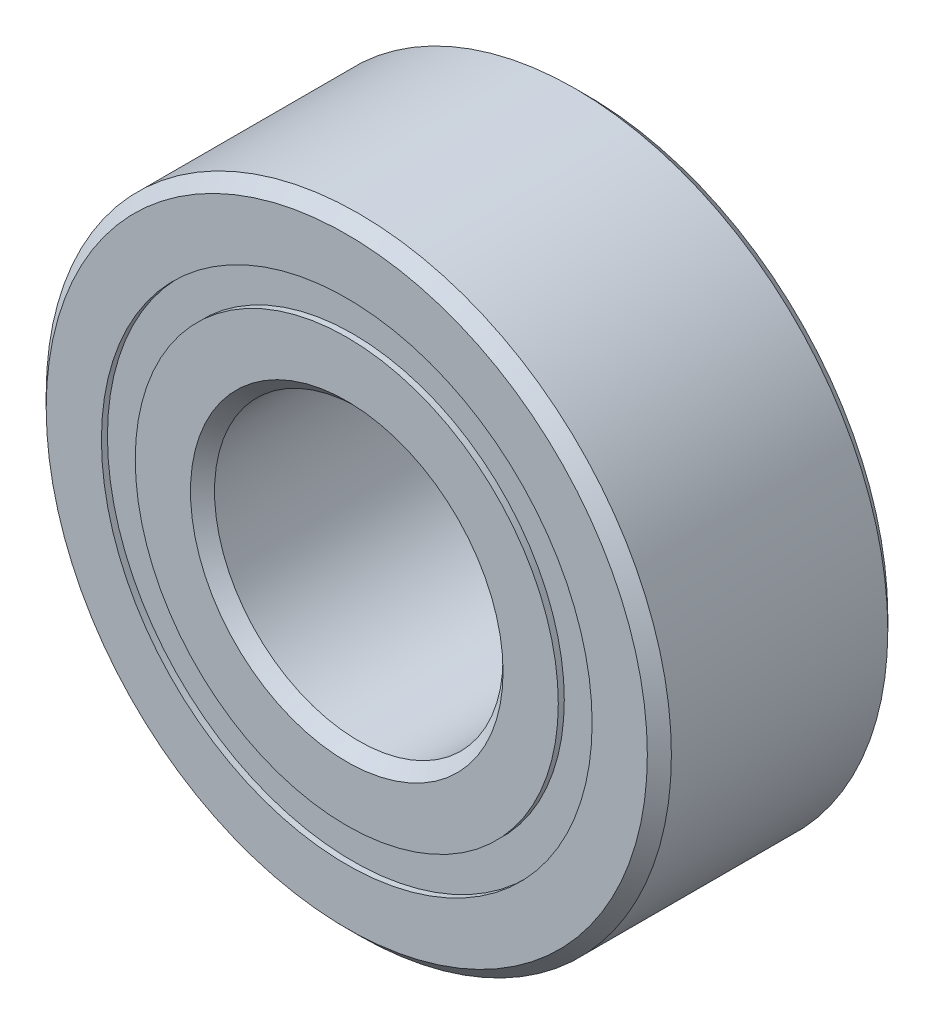
ISO-10303-21;
HEADER;
FILE_DESCRIPTION(('STEP AP214'),'2;1');
FILE_NAME('part.step','',(''),(''),'','','');
FILE_SCHEMA(('AUTOMOTIVE_DESIGN { 1 0 10303 214 1 1 1 1 }'));
ENDSEC;
DATA;
#1=APPLICATION_CONTEXT('core data for automotive mechanical design processes');
#2=APPLICATION_PROTOCOL_DEFINITION('international standard','automotive_design',2000,#1);
#3=PRODUCT_CONTEXT('',#1,'mechanical');
#4=PRODUCT('Part','Part','',(#3));
#5=PRODUCT_RELATED_PRODUCT_CATEGORY('part','',(#4));
#6=PRODUCT_DEFINITION_FORMATION('','',#4);
#7=PRODUCT_DEFINITION_CONTEXT('part definition',#1,'design');
#8=PRODUCT_DEFINITION('design','',#6,#7);
#9=PRODUCT_DEFINITION_SHAPE('','',#8);
#10=(LENGTH_UNIT() NAMED_UNIT(*) SI_UNIT(.MILLI.,.METRE.));
#11=(NAMED_UNIT(*) PLANE_ANGLE_UNIT() SI_UNIT($,.RADIAN.));
#12=(NAMED_UNIT(*) SI_UNIT($,.STERADIAN.) SOLID_ANGLE_UNIT());
#13=UNCERTAINTY_MEASURE_WITH_UNIT(LENGTH_MEASURE(1.E-05),#10,'distance_accuracy_value','');
#14=(GEOMETRIC_REPRESENTATION_CONTEXT(3) GLOBAL_UNCERTAINTY_ASSIGNED_CONTEXT((#13)) GLOBAL_UNIT_ASSIGNED_CONTEXT((#10,
#11,#12)) REPRESENTATION_CONTEXT('',''));
#15=CARTESIAN_POINT('',(0.,0.,0.));
#16=DIRECTION('',(0.,0.,1.));
#17=DIRECTION('',(1.,0.,0.));
#18=AXIS2_PLACEMENT_3D('',#15,#16,#17);
#19=CARTESIAN_POINT('',(0.,5.10164835164835,-2.375));
#20=DIRECTION('',(0.,0.,1.));
#21=DIRECTION('',(1.,0.,0.));
#22=AXIS2_PLACEMENT_3D('',#19,#20,#21);
#23=PLANE('',#22);
#24=CARTESIAN_POINT('',(0.,0.,-2.375));
#25=DIRECTION('',(0.,0.,1.));
#26=DIRECTION('',(1.,0.,0.));
#27=AXIS2_PLACEMENT_3D('',#24,#25,#26);
#28=CIRCLE('',#27,5.10164835164835);
#29=CARTESIAN_POINT('',(5.10164835164835,0.,-2.375));
#30=VERTEX_POINT('',#29);
#31=EDGE_CURVE('E55',#30,#30,#28,.T.);
#32=ORIENTED_EDGE('',*,*,#31,.F.);
#33=EDGE_LOOP('',(#32));
#34=FACE_BOUND('',#33,.T.);
#35=CARTESIAN_POINT('',(0.,0.,-2.375));
#36=DIRECTION('',(0.,0.,1.));
#37=DIRECTION('',(1.,0.,0.));
#38=AXIS2_PLACEMENT_3D('',#35,#36,#37);
#39=CIRCLE('',#38,4.39835164835165);
#40=CARTESIAN_POINT('',(4.39835164835165,0.,-2.375));
#41=VERTEX_POINT('',#40);
#42=EDGE_CURVE('E11',#41,#41,#39,.T.);
#43=ORIENTED_EDGE('',*,*,#42,.T.);
#44=EDGE_LOOP('',(#43));
#45=FACE_BOUND('',#44,.T.);
#46=ADVANCED_FACE('F41',(#34,#45),#23,.F.);
#47=CARTESIAN_POINT('',(0.,0.,2.5));
#48=DIRECTION('',(0.,0.,1.));
#49=DIRECTION('',(1.,0.,0.));
#50=AXIS2_PLACEMENT_3D('',#47,#48,#49);
#51=CYLINDRICAL_SURFACE('',#50,4.39835164835165);
#52=ORIENTED_EDGE('',*,*,#42,.F.);
#53=EDGE_LOOP('',(#52));
#54=FACE_BOUND('',#53,.T.);
#55=CARTESIAN_POINT('',(0.,0.,-1.16542887575844));
#56=DIRECTION('',(0.,0.,1.));
#57=DIRECTION('',(1.,0.,0.));
#58=AXIS2_PLACEMENT_3D('',#55,#56,#57);
#59=CIRCLE('',#58,4.39835164835165);
#60=CARTESIAN_POINT('',(4.39835164835165,0.,-1.16542887575844));
#61=VERTEX_POINT('',#60);
#62=EDGE_CURVE('E47',#61,#61,#59,.T.);
#63=ORIENTED_EDGE('',*,*,#62,.T.);
#64=EDGE_LOOP('',(#63));
#65=FACE_BOUND('',#64,.T.);
#66=ADVANCED_FACE('F64',(#54,#65),#51,.F.);
#67=CARTESIAN_POINT('',(0.,5.10164835164835,-1.16542887575844));
#68=DIRECTION('',(0.,0.,-1.));
#69=DIRECTION('',(-1.,0.,0.));
#70=AXIS2_PLACEMENT_3D('',#67,#68,#69);
#71=PLANE('',#70);
#72=ORIENTED_EDGE('',*,*,#62,.F.);
#73=EDGE_LOOP('',(#72));
#74=FACE_BOUND('',#73,.T.);
#75=CARTESIAN_POINT('',(0.,0.,-1.16542887575844));
#76=DIRECTION('',(0.,0.,1.));
#77=DIRECTION('',(1.,0.,0.));
#78=AXIS2_PLACEMENT_3D('',#75,#76,#77);
#79=CIRCLE('',#78,5.10164835164835);
#80=CARTESIAN_POINT('',(5.10164835164835,0.,-1.16542887575844));
#81=VERTEX_POINT('',#80);
#82=EDGE_CURVE('E51',#81,#81,#79,.T.);
#83=ORIENTED_EDGE('',*,*,#82,.T.);
#84=EDGE_LOOP('',(#83));
#85=FACE_BOUND('',#84,.T.);
#86=ADVANCED_FACE('F68',(#74,#85),#71,.F.);
#87=CARTESIAN_POINT('',(0.,0.,2.5));
#88=DIRECTION('',(0.,0.,1.));
#89=DIRECTION('',(1.,0.,0.));
#90=AXIS2_PLACEMENT_3D('',#87,#88,#89);
#91=CYLINDRICAL_SURFACE('',#90,5.10164835164835);
#92=ORIENTED_EDGE('',*,*,#82,.F.);
#93=EDGE_LOOP('',(#92));
#94=FACE_BOUND('',#93,.T.);
#95=ORIENTED_EDGE('',*,*,#31,.T.);
#96=EDGE_LOOP('',(#95));
#97=FACE_BOUND('',#96,.T.);
#98=ADVANCED_FACE('F61',(#94,#97),#91,.T.);
#99=CLOSED_SHELL('',(#46,#66,#86,#98));
#100=MANIFOLD_SOLID_BREP('B2',#99);
#101=CARTESIAN_POINT('',(0.,5.10164835164835,2.375));
#102=DIRECTION('',(0.,0.,-1.));
#103=DIRECTION('',(-1.,0.,0.));
#104=AXIS2_PLACEMENT_3D('',#101,#102,#103);
#105=PLANE('',#104);
#106=CARTESIAN_POINT('',(0.,0.,2.375));
#107=DIRECTION('',(0.,0.,1.));
#108=DIRECTION('',(1.,0.,0.));
#109=AXIS2_PLACEMENT_3D('',#106,#107,#108);
#110=CIRCLE('',#109,4.39835164835165);
#111=CARTESIAN_POINT('',(4.39835164835165,0.,2.375));
#112=VERTEX_POINT('',#111);
#113=EDGE_CURVE('E40',#112,#112,#110,.T.);
#114=ORIENTED_EDGE('',*,*,#113,.F.);
#115=EDGE_LOOP('',(#114));
#116=FACE_BOUND('',#115,.T.);
#117=CARTESIAN_POINT('',(0.,0.,2.375));
#118=DIRECTION('',(0.,0.,1.));
#119=DIRECTION('',(1.,0.,0.));
#120=AXIS2_PLACEMENT_3D('',#117,#118,#119);
#121=CIRCLE('',#120,5.10164835164835);
#122=CARTESIAN_POINT('',(5.10164835164835,0.,2.375));
#123=VERTEX_POINT('',#122);
#124=EDGE_CURVE('E122',#123,#123,#121,.T.);
#125=ORIENTED_EDGE('',*,*,#124,.T.);
#126=EDGE_LOOP('',(#125));
#127=FACE_BOUND('',#126,.T.);
#128=ADVANCED_FACE('F108',(#116,#127),#105,.F.);
#129=CARTESIAN_POINT('',(0.,0.,2.5));
#130=DIRECTION('',(0.,0.,1.));
#131=DIRECTION('',(1.,0.,0.));
#132=AXIS2_PLACEMENT_3D('',#129,#130,#131);
#133=CYLINDRICAL_SURFACE('',#132,4.39835164835165);
#134=CARTESIAN_POINT('',(0.,0.,1.16542887575844));
#135=DIRECTION('',(0.,0.,1.));
#136=DIRECTION('',(1.,0.,0.));
#137=AXIS2_PLACEMENT_3D('',#134,#135,#136);
#138=CIRCLE('',#137,4.39835164835165);
#139=CARTESIAN_POINT('',(4.39835164835165,0.,1.16542887575844));
#140=VERTEX_POINT('',#139);
#141=EDGE_CURVE('E114',#140,#140,#138,.T.);
#142=ORIENTED_EDGE('',*,*,#141,.F.);
#143=EDGE_LOOP('',(#142));
#144=FACE_BOUND('',#143,.T.);
#145=ORIENTED_EDGE('',*,*,#113,.T.);
#146=EDGE_LOOP('',(#145));
#147=FACE_BOUND('',#146,.T.);
#148=ADVANCED_FACE('F137',(#144,#147),#133,.F.);
#149=CARTESIAN_POINT('',(0.,5.10164835164835,1.16542887575844));
#150=DIRECTION('',(0.,0.,1.));
#151=DIRECTION('',(1.,0.,0.));
#152=AXIS2_PLACEMENT_3D('',#149,#150,#151);
#153=PLANE('',#152);
#154=CARTESIAN_POINT('',(0.,0.,1.16542887575844));
#155=DIRECTION('',(0.,0.,1.));
#156=DIRECTION('',(1.,0.,0.));
#157=AXIS2_PLACEMENT_3D('',#154,#155,#156);
#158=CIRCLE('',#157,5.10164835164835);
#159=CARTESIAN_POINT('',(5.10164835164835,0.,1.16542887575844));
#160=VERTEX_POINT('',#159);
#161=EDGE_CURVE('E118',#160,#160,#158,.T.);
#162=ORIENTED_EDGE('',*,*,#161,.F.);
#163=EDGE_LOOP('',(#162));
#164=FACE_BOUND('',#163,.T.);
#165=ORIENTED_EDGE('',*,*,#141,.T.);
#166=EDGE_LOOP('',(#165));
#167=FACE_BOUND('',#166,.T.);
#168=ADVANCED_FACE('F132',(#164,#167),#153,.F.);
#169=CARTESIAN_POINT('',(0.,0.,2.5));
#170=DIRECTION('',(0.,0.,1.));
#171=DIRECTION('',(1.,0.,0.));
#172=AXIS2_PLACEMENT_3D('',#169,#170,#171);
#173=CYLINDRICAL_SURFACE('',#172,5.10164835164835);
#174=ORIENTED_EDGE('',*,*,#124,.F.);
#175=EDGE_LOOP('',(#174));
#176=FACE_BOUND('',#175,.T.);
#177=ORIENTED_EDGE('',*,*,#161,.T.);
#178=EDGE_LOOP('',(#177));
#179=FACE_BOUND('',#178,.T.);
#180=ADVANCED_FACE('F129',(#176,#179),#173,.T.);
#181=CLOSED_SHELL('',(#128,#148,#168,#180));
#182=MANIFOLD_SOLID_BREP('B6',#181);
#183=CARTESIAN_POINT('',(-2.37499999999995,4.11362066797611,0.));
#184=DIRECTION('',(0.,0.,1.));
#185=DIRECTION('',(-0.499999999999989,0.866025403784445,0.));
#186=AXIS2_PLACEMENT_3D('',#183,#184,#185);
#187=SPHERICAL_SURFACE('',#186,1.16542887575844);
#188=CARTESIAN_POINT('',(-2.37499999999995,4.11362066797611,1.16542887575844));
#189=VERTEX_POINT('',#188);
#190=VERTEX_LOOP('',#189);
#191=FACE_BOUND('',#190,.T.);
#192=ADVANCED_FACE('F175',(#191),#187,.T.);
#193=CLOSED_SHELL('',(#192));
#194=MANIFOLD_SOLID_BREP('B35',#193);
#195=CARTESIAN_POINT('',(-4.11362066797606,2.37500000000005,0.));
#196=DIRECTION('',(0.,0.,1.));
#197=DIRECTION('',(-0.866025403784433,0.50000000000001,0.));
#198=AXIS2_PLACEMENT_3D('',#195,#196,#197);
#199=SPHERICAL_SURFACE('',#198,1.16542887575844);
#200=CARTESIAN_POINT('',(-4.11362066797606,2.37500000000005,1.16542887575844));
#201=VERTEX_POINT('',#200);
#202=VERTEX_LOOP('',#201);
#203=FACE_BOUND('',#202,.T.);
#204=ADVANCED_FACE('F195',(#203),#199,.T.);
#205=CLOSED_SHELL('',(#204));
#206=MANIFOLD_SOLID_BREP('B104',#205);
#207=CARTESIAN_POINT('',(-4.75,0.,0.));
#208=DIRECTION('',(0.,0.,1.));
#209=DIRECTION('',(-1.,0.,0.));
#210=AXIS2_PLACEMENT_3D('',#207,#208,#209);
#211=SPHERICAL_SURFACE('',#210,1.16542887575844);
#212=CARTESIAN_POINT('',(-4.75,0.,1.16542887575844));
#213=VERTEX_POINT('',#212);
#214=VERTEX_LOOP('',#213);
#215=FACE_BOUND('',#214,.T.);
#216=ADVANCED_FACE('F215',(#215),#211,.T.);
#217=CLOSED_SHELL('',(#216));
#218=MANIFOLD_SOLID_BREP('B171',#217);
#219=CARTESIAN_POINT('',(-4.1136206679761,-2.37499999999996,0.));
#220=DIRECTION('',(0.,0.,1.));
#221=DIRECTION('',(-0.866025403784443,-0.499999999999992,0.));
#222=AXIS2_PLACEMENT_3D('',#219,#220,#221);
#223=SPHERICAL_SURFACE('',#222,1.16542887575844);
#224=CARTESIAN_POINT('',(-4.1136206679761,-2.37499999999996,1.16542887575844));
#225=VERTEX_POINT('',#224);
#226=VERTEX_LOOP('',#225);
#227=FACE_BOUND('',#226,.T.);
#228=ADVANCED_FACE('F235',(#227),#223,.T.);
#229=CLOSED_SHELL('',(#228));
#230=MANIFOLD_SOLID_BREP('B191',#229);
#231=CARTESIAN_POINT('',(-2.37500000000003,-4.11362066797606,0.));
#232=DIRECTION('',(0.,0.,1.));
#233=DIRECTION('',(-0.500000000000007,-0.866025403784435,0.));
#234=AXIS2_PLACEMENT_3D('',#231,#232,#233);
#235=SPHERICAL_SURFACE('',#234,1.16542887575844);
#236=CARTESIAN_POINT('',(-2.37500000000003,-4.11362066797606,1.16542887575844));
#237=VERTEX_POINT('',#236);
#238=VERTEX_LOOP('',#237);
#239=FACE_BOUND('',#238,.T.);
#240=ADVANCED_FACE('F255',(#239),#235,.T.);
#241=CLOSED_SHELL('',(#240));
#242=MANIFOLD_SOLID_BREP('B211',#241);
#243=CARTESIAN_POINT('',(0.,-4.75,0.));
#244=DIRECTION('',(0.,0.,1.));
#245=DIRECTION('',(0.,-1.,0.));
#246=AXIS2_PLACEMENT_3D('',#243,#244,#245);
#247=SPHERICAL_SURFACE('',#246,1.16542887575844);
#248=CARTESIAN_POINT('',(0.,-4.75,1.16542887575844));
#249=VERTEX_POINT('',#248);
#250=VERTEX_LOOP('',#249);
#251=FACE_BOUND('',#250,.T.);
#252=ADVANCED_FACE('F275',(#251),#247,.T.);
#253=CLOSED_SHELL('',(#252));
#254=MANIFOLD_SOLID_BREP('B231',#253);
#255=CARTESIAN_POINT('',(2.37499999999998,-4.1136206679761,0.));
#256=DIRECTION('',(0.,0.,1.));
#257=DIRECTION('',(0.499999999999995,-0.866025403784442,0.));
#258=AXIS2_PLACEMENT_3D('',#255,#256,#257);
#259=SPHERICAL_SURFACE('',#258,1.16542887575844);
#260=CARTESIAN_POINT('',(2.37499999999998,-4.1136206679761,1.16542887575844));
#261=VERTEX_POINT('',#260);
#262=VERTEX_LOOP('',#261);
#263=FACE_BOUND('',#262,.T.);
#264=ADVANCED_FACE('F295',(#263),#259,.T.);
#265=CLOSED_SHELL('',(#264));
#266=MANIFOLD_SOLID_BREP('B251',#265);
#267=CARTESIAN_POINT('',(4.11362066797607,-2.37500000000002,0.));
#268=DIRECTION('',(0.,0.,1.));
#269=DIRECTION('',(0.866025403784436,-0.500000000000004,0.));
#270=AXIS2_PLACEMENT_3D('',#267,#268,#269);
#271=SPHERICAL_SURFACE('',#270,1.16542887575844);
#272=CARTESIAN_POINT('',(4.11362066797607,-2.37500000000002,1.16542887575844));
#273=VERTEX_POINT('',#272);
#274=VERTEX_LOOP('',#273);
#275=FACE_BOUND('',#274,.T.);
#276=ADVANCED_FACE('F315',(#275),#271,.T.);
#277=CLOSED_SHELL('',(#276));
#278=MANIFOLD_SOLID_BREP('B271',#277);
#279=CARTESIAN_POINT('',(4.75,0.,0.));
#280=DIRECTION('',(0.,0.,1.));
#281=DIRECTION('',(1.,0.,0.));
#282=AXIS2_PLACEMENT_3D('',#279,#280,#281);
#283=SPHERICAL_SURFACE('',#282,1.16542887575844);
#284=CARTESIAN_POINT('',(4.75,0.,1.16542887575844));
#285=VERTEX_POINT('',#284);
#286=VERTEX_LOOP('',#285);
#287=FACE_BOUND('',#286,.T.);
#288=ADVANCED_FACE('F335',(#287),#283,.T.);
#289=CLOSED_SHELL('',(#288));
#290=MANIFOLD_SOLID_BREP('B291',#289);
#291=CARTESIAN_POINT('',(4.11362066797609,2.37499999999999,0.));
#292=DIRECTION('',(0.,0.,1.));
#293=DIRECTION('',(0.86602540378444,0.499999999999998,0.));
#294=AXIS2_PLACEMENT_3D('',#291,#292,#293);
#295=SPHERICAL_SURFACE('',#294,1.16542887575844);
#296=CARTESIAN_POINT('',(4.11362066797609,2.37499999999999,1.16542887575844));
#297=VERTEX_POINT('',#296);
#298=VERTEX_LOOP('',#297);
#299=FACE_BOUND('',#298,.T.);
#300=ADVANCED_FACE('F355',(#299),#295,.T.);
#301=CLOSED_SHELL('',(#300));
#302=MANIFOLD_SOLID_BREP('B311',#301);
#303=CARTESIAN_POINT('',(2.375,4.11362066797608,0.));
#304=DIRECTION('',(0.,0.,1.));
#305=DIRECTION('',(0.500000000000001,0.866025403784438,0.));
#306=AXIS2_PLACEMENT_3D('',#303,#304,#305);
#307=SPHERICAL_SURFACE('',#306,1.16542887575844);
#308=CARTESIAN_POINT('',(2.375,4.11362066797608,1.16542887575844));
#309=VERTEX_POINT('',#308);
#310=VERTEX_LOOP('',#309);
#311=FACE_BOUND('',#310,.T.);
#312=ADVANCED_FACE('F375',(#311),#307,.T.);
#313=CLOSED_SHELL('',(#312));
#314=MANIFOLD_SOLID_BREP('B331',#313);
#315=CARTESIAN_POINT('',(0.,4.75,0.));
#316=DIRECTION('',(0.,0.,1.));
#317=DIRECTION('',(0.,1.,0.));
#318=AXIS2_PLACEMENT_3D('',#315,#316,#317);
#319=SPHERICAL_SURFACE('',#318,1.16542887575844);
#320=CARTESIAN_POINT('',(0.,4.75,1.16542887575844));
#321=VERTEX_POINT('',#320);
#322=VERTEX_LOOP('',#321);
#323=FACE_BOUND('',#322,.T.);
#324=ADVANCED_FACE('F397',(#323),#319,.T.);
#325=CLOSED_SHELL('',(#324));
#326=MANIFOLD_SOLID_BREP('B351',#325);
#327=CARTESIAN_POINT('',(0.,4.39835164835165,2.5));
#328=DIRECTION('',(0.,0.,-1.));
#329=DIRECTION('',(-1.,0.,0.));
#330=AXIS2_PLACEMENT_3D('',#327,#328,#329);
#331=PLANE('',#330);
#332=CARTESIAN_POINT('',(0.,0.,2.5));
#333=DIRECTION('',(0.,0.,1.));
#334=DIRECTION('',(1.,0.,0.));
#335=AXIS2_PLACEMENT_3D('',#332,#333,#334);
#336=CIRCLE('',#335,3.25);
#337=CARTESIAN_POINT('',(3.25,0.,2.5));
#338=VERTEX_POINT('',#337);
#339=EDGE_CURVE('E444',#338,#338,#336,.T.);
#340=ORIENTED_EDGE('',*,*,#339,.F.);
#341=EDGE_LOOP('',(#340));
#342=FACE_BOUND('',#341,.T.);
#343=CARTESIAN_POINT('',(0.,0.,2.5));
#344=DIRECTION('',(0.,0.,1.));
#345=DIRECTION('',(1.,0.,0.));
#346=AXIS2_PLACEMENT_3D('',#343,#344,#345);
#347=CIRCLE('',#346,4.39835164835165);
#348=CARTESIAN_POINT('',(4.39835164835165,0.,2.5));
#349=VERTEX_POINT('',#348);
#350=EDGE_CURVE('E396',#349,#349,#347,.T.);
#351=ORIENTED_EDGE('',*,*,#350,.T.);
#352=EDGE_LOOP('',(#351));
#353=FACE_BOUND('',#352,.T.);
#354=ADVANCED_FACE('F416',(#342,#353),#331,.F.);
#355=CARTESIAN_POINT('',(0.,0.,2.5));
#356=DIRECTION('',(0.,0.,1.));
#357=DIRECTION('',(1.,0.,0.));
#358=AXIS2_PLACEMENT_3D('',#355,#356,#357);
#359=CYLINDRICAL_SURFACE('',#358,4.39835164835165);
#360=ORIENTED_EDGE('',*,*,#350,.F.);
#361=EDGE_LOOP('',(#360));
#362=FACE_BOUND('',#361,.T.);
#363=CARTESIAN_POINT('',(0.,0.,1.11111111111111));
#364=DIRECTION('',(0.,0.,1.));
#365=DIRECTION('',(1.,0.,0.));
#366=AXIS2_PLACEMENT_3D('',#363,#364,#365);
#367=CIRCLE('',#366,4.39835164835165);
#368=CARTESIAN_POINT('',(4.39835164835165,0.,1.11111111111111));
#369=VERTEX_POINT('',#368);
#370=EDGE_CURVE('E422',#369,#369,#367,.T.);
#371=ORIENTED_EDGE('',*,*,#370,.T.);
#372=EDGE_LOOP('',(#371));
#373=FACE_BOUND('',#372,.T.);
#374=ADVANCED_FACE('F451',(#362,#373),#359,.T.);
#375=CARTESIAN_POINT('',(0.,0.,0.));
#376=DIRECTION('',(0.,0.,1.));
#377=DIRECTION('',(1.,0.,0.));
#378=AXIS2_PLACEMENT_3D('',#375,#376,#377);
#379=TOROIDAL_SURFACE('',#378,4.75,1.16542887575843);
#380=ORIENTED_EDGE('',*,*,#370,.F.);
#381=EDGE_LOOP('',(#380));
#382=FACE_BOUND('',#381,.T.);
#383=CARTESIAN_POINT('',(0.,0.,-1.11111111111111));
#384=DIRECTION('',(0.,0.,1.));
#385=DIRECTION('',(1.,0.,0.));
#386=AXIS2_PLACEMENT_3D('',#383,#384,#385);
#387=CIRCLE('',#386,4.39835164835165);
#388=CARTESIAN_POINT('',(4.39835164835165,0.,-1.11111111111111));
#389=VERTEX_POINT('',#388);
#390=EDGE_CURVE('E426',#389,#389,#387,.T.);
#391=ORIENTED_EDGE('',*,*,#390,.T.);
#392=EDGE_LOOP('',(#391));
#393=FACE_BOUND('',#392,.T.);
#394=ADVANCED_FACE('F455',(#382,#393),#379,.F.);
#395=CARTESIAN_POINT('',(0.,0.,2.5));
#396=DIRECTION('',(0.,0.,1.));
#397=DIRECTION('',(1.,0.,0.));
#398=AXIS2_PLACEMENT_3D('',#395,#396,#397);
#399=CYLINDRICAL_SURFACE('',#398,4.39835164835165);
#400=ORIENTED_EDGE('',*,*,#390,.F.);
#401=EDGE_LOOP('',(#400));
#402=FACE_BOUND('',#401,.T.);
#403=CARTESIAN_POINT('',(0.,0.,-2.5));
#404=DIRECTION('',(0.,0.,1.));
#405=DIRECTION('',(1.,0.,0.));
#406=AXIS2_PLACEMENT_3D('',#403,#404,#405);
#407=CIRCLE('',#406,4.39835164835165);
#408=CARTESIAN_POINT('',(4.39835164835165,0.,-2.5));
#409=VERTEX_POINT('',#408);
#410=EDGE_CURVE('E430',#409,#409,#407,.T.);
#411=ORIENTED_EDGE('',*,*,#410,.T.);
#412=EDGE_LOOP('',(#411));
#413=FACE_BOUND('',#412,.T.);
#414=ADVANCED_FACE('F460',(#402,#413),#399,.T.);
#415=CARTESIAN_POINT('',(0.,3.25,-2.5));
#416=DIRECTION('',(0.,0.,1.));
#417=DIRECTION('',(1.,0.,0.));
#418=AXIS2_PLACEMENT_3D('',#415,#416,#417);
#419=PLANE('',#418);
#420=ORIENTED_EDGE('',*,*,#410,.F.);
#421=EDGE_LOOP('',(#420));
#422=FACE_BOUND('',#421,.T.);
#423=CARTESIAN_POINT('',(0.,0.,-2.5));
#424=DIRECTION('',(0.,0.,1.));
#425=DIRECTION('',(1.,0.,0.));
#426=AXIS2_PLACEMENT_3D('',#423,#424,#425);
#427=CIRCLE('',#426,3.25);
#428=CARTESIAN_POINT('',(3.25,0.,-2.5));
#429=VERTEX_POINT('',#428);
#430=EDGE_CURVE('E435',#429,#429,#427,.T.);
#431=ORIENTED_EDGE('',*,*,#430,.T.);
#432=EDGE_LOOP('',(#431));
#433=FACE_BOUND('',#432,.T.);
#434=ADVANCED_FACE('F466',(#422,#433),#419,.F.);
#435=CARTESIAN_POINT('',(0.,0.,-2.25));
#436=DIRECTION('',(0.,0.,-1.));
#437=DIRECTION('',(-1.,0.,0.));
#438=AXIS2_PLACEMENT_3D('',#435,#436,#437);
#439=CONICAL_SURFACE('',#438,3.,0.785398163397447);
#440=ORIENTED_EDGE('',*,*,#430,.F.);
#441=EDGE_LOOP('',(#440));
#442=FACE_BOUND('',#441,.T.);
#443=CARTESIAN_POINT('',(0.,0.,-2.25));
#444=DIRECTION('',(0.,0.,1.));
#445=DIRECTION('',(1.,0.,0.));
#446=AXIS2_PLACEMENT_3D('',#443,#444,#445);
#447=CIRCLE('',#446,3.);
#448=CARTESIAN_POINT('',(3.,0.,-2.25));
#449=VERTEX_POINT('',#448);
#450=EDGE_CURVE('E438',#449,#449,#447,.T.);
#451=ORIENTED_EDGE('',*,*,#450,.T.);
#452=EDGE_LOOP('',(#451));
#453=FACE_BOUND('',#452,.T.);
#454=ADVANCED_FACE('F470',(#442,#453),#439,.F.);
#455=CARTESIAN_POINT('',(0.,0.,2.5));
#456=DIRECTION('',(0.,0.,1.));
#457=DIRECTION('',(1.,0.,0.));
#458=AXIS2_PLACEMENT_3D('',#455,#456,#457);
#459=CYLINDRICAL_SURFACE('',#458,3.);
#460=ORIENTED_EDGE('',*,*,#450,.F.);
#461=EDGE_LOOP('',(#460));
#462=FACE_BOUND('',#461,.T.);
#463=CARTESIAN_POINT('',(0.,0.,2.25));
#464=DIRECTION('',(0.,0.,1.));
#465=DIRECTION('',(1.,0.,0.));
#466=AXIS2_PLACEMENT_3D('',#463,#464,#465);
#467=CIRCLE('',#466,3.);
#468=CARTESIAN_POINT('',(3.,0.,2.25));
#469=VERTEX_POINT('',#468);
#470=EDGE_CURVE('E441',#469,#469,#467,.T.);
#471=ORIENTED_EDGE('',*,*,#470,.T.);
#472=EDGE_LOOP('',(#471));
#473=FACE_BOUND('',#472,.T.);
#474=ADVANCED_FACE('F474',(#462,#473),#459,.F.);
#475=CARTESIAN_POINT('',(0.,0.,2.5));
#476=DIRECTION('',(0.,0.,1.));
#477=DIRECTION('',(1.,0.,0.));
#478=AXIS2_PLACEMENT_3D('',#475,#476,#477);
#479=CONICAL_SURFACE('',#478,3.25,0.785398163397452);
#480=ORIENTED_EDGE('',*,*,#470,.F.);
#481=EDGE_LOOP('',(#480));
#482=FACE_BOUND('',#481,.T.);
#483=ORIENTED_EDGE('',*,*,#339,.T.);
#484=EDGE_LOOP('',(#483));
#485=FACE_BOUND('',#484,.T.);
#486=ADVANCED_FACE('F448',(#482,#485),#479,.F.);
#487=CLOSED_SHELL('',(#354,#374,#394,#414,#434,#454,#474,#486));
#488=MANIFOLD_SOLID_BREP('B371',#487);
#489=CARTESIAN_POINT('',(0.,0.,2.25));
#490=DIRECTION('',(0.,0.,-1.));
#491=DIRECTION('',(-1.,0.,0.));
#492=AXIS2_PLACEMENT_3D('',#489,#490,#491);
#493=CONICAL_SURFACE('',#492,6.5,0.785398163397445);
#494=CARTESIAN_POINT('',(0.,0.,2.5));
#495=DIRECTION('',(0.,0.,1.));
#496=DIRECTION('',(1.,0.,0.));
#497=AXIS2_PLACEMENT_3D('',#494,#495,#496);
#498=CIRCLE('',#497,6.25);
#499=CARTESIAN_POINT('',(6.25,0.,2.5));
#500=VERTEX_POINT('',#499);
#501=EDGE_CURVE('E565',#500,#500,#498,.T.);
#502=ORIENTED_EDGE('',*,*,#501,.F.);
#503=EDGE_LOOP('',(#502));
#504=FACE_BOUND('',#503,.T.);
#505=CARTESIAN_POINT('',(0.,0.,2.25));
#506=DIRECTION('',(0.,0.,1.));
#507=DIRECTION('',(1.,0.,0.));
#508=AXIS2_PLACEMENT_3D('',#505,#506,#507);
#509=CIRCLE('',#508,6.5);
#510=CARTESIAN_POINT('',(6.5,0.,2.25));
#511=VERTEX_POINT('',#510);
#512=EDGE_CURVE('E415',#511,#511,#509,.T.);
#513=ORIENTED_EDGE('',*,*,#512,.T.);
#514=EDGE_LOOP('',(#513));
#515=FACE_BOUND('',#514,.T.);
#516=ADVANCED_FACE('F537',(#504,#515),#493,.T.);
#517=CARTESIAN_POINT('',(0.,0.,2.5));
#518=DIRECTION('',(0.,0.,1.));
#519=DIRECTION('',(1.,0.,0.));
#520=AXIS2_PLACEMENT_3D('',#517,#518,#519);
#521=CYLINDRICAL_SURFACE('',#520,6.5);
#522=ORIENTED_EDGE('',*,*,#512,.F.);
#523=EDGE_LOOP('',(#522));
#524=FACE_BOUND('',#523,.T.);
#525=CARTESIAN_POINT('',(0.,0.,-2.25));
#526=DIRECTION('',(0.,0.,1.));
#527=DIRECTION('',(1.,0.,0.));
#528=AXIS2_PLACEMENT_3D('',#525,#526,#527);
#529=CIRCLE('',#528,6.5);
#530=CARTESIAN_POINT('',(6.5,0.,-2.25));
#531=VERTEX_POINT('',#530);
#532=EDGE_CURVE('E543',#531,#531,#529,.T.);
#533=ORIENTED_EDGE('',*,*,#532,.T.);
#534=EDGE_LOOP('',(#533));
#535=FACE_BOUND('',#534,.T.);
#536=ADVANCED_FACE('F572',(#524,#535),#521,.T.);
#537=CARTESIAN_POINT('',(0.,0.,-2.5));
#538=DIRECTION('',(0.,0.,1.));
#539=DIRECTION('',(1.,0.,0.));
#540=AXIS2_PLACEMENT_3D('',#537,#538,#539);
#541=CONICAL_SURFACE('',#540,6.25,0.785398163397445);
#542=ORIENTED_EDGE('',*,*,#532,.F.);
#543=EDGE_LOOP('',(#542));
#544=FACE_BOUND('',#543,.T.);
#545=CARTESIAN_POINT('',(0.,0.,-2.5));
#546=DIRECTION('',(0.,0.,1.));
#547=DIRECTION('',(1.,0.,0.));
#548=AXIS2_PLACEMENT_3D('',#545,#546,#547);
#549=CIRCLE('',#548,6.25);
#550=CARTESIAN_POINT('',(6.25,0.,-2.5));
#551=VERTEX_POINT('',#550);
#552=EDGE_CURVE('E547',#551,#551,#549,.T.);
#553=ORIENTED_EDGE('',*,*,#552,.T.);
#554=EDGE_LOOP('',(#553));
#555=FACE_BOUND('',#554,.T.);
#556=ADVANCED_FACE('F576',(#544,#555),#541,.T.);
#557=CARTESIAN_POINT('',(0.,6.25,-2.5));
#558=DIRECTION('',(0.,0.,1.));
#559=DIRECTION('',(1.,0.,0.));
#560=AXIS2_PLACEMENT_3D('',#557,#558,#559);
#561=PLANE('',#560);
#562=ORIENTED_EDGE('',*,*,#552,.F.);
#563=EDGE_LOOP('',(#562));
#564=FACE_BOUND('',#563,.T.);
#565=CARTESIAN_POINT('',(0.,0.,-2.5));
#566=DIRECTION('',(0.,0.,1.));
#567=DIRECTION('',(1.,0.,0.));
#568=AXIS2_PLACEMENT_3D('',#565,#566,#567);
#569=CIRCLE('',#568,5.10164835164835);
#570=CARTESIAN_POINT('',(5.10164835164835,0.,-2.5));
#571=VERTEX_POINT('',#570);
#572=EDGE_CURVE('E551',#571,#571,#569,.T.);
#573=ORIENTED_EDGE('',*,*,#572,.T.);
#574=EDGE_LOOP('',(#573));
#575=FACE_BOUND('',#574,.T.);
#576=ADVANCED_FACE('F581',(#564,#575),#561,.F.);
#577=CARTESIAN_POINT('',(0.,0.,2.5));
#578=DIRECTION('',(0.,0.,1.));
#579=DIRECTION('',(1.,0.,0.));
#580=AXIS2_PLACEMENT_3D('',#577,#578,#579);
#581=CYLINDRICAL_SURFACE('',#580,5.10164835164835);
#582=ORIENTED_EDGE('',*,*,#572,.F.);
#583=EDGE_LOOP('',(#582));
#584=FACE_BOUND('',#583,.T.);
#585=CARTESIAN_POINT('',(0.,0.,-1.11111111111111));
#586=DIRECTION('',(0.,0.,1.));
#587=DIRECTION('',(1.,0.,0.));
#588=AXIS2_PLACEMENT_3D('',#585,#586,#587);
#589=CIRCLE('',#588,5.10164835164835);
#590=CARTESIAN_POINT('',(5.10164835164835,0.,-1.11111111111111));
#591=VERTEX_POINT('',#590);
#592=EDGE_CURVE('E556',#591,#591,#589,.T.);
#593=ORIENTED_EDGE('',*,*,#592,.T.);
#594=EDGE_LOOP('',(#593));
#595=FACE_BOUND('',#594,.T.);
#596=ADVANCED_FACE('F587',(#584,#595),#581,.F.);
#597=CARTESIAN_POINT('',(0.,0.,0.));
#598=DIRECTION('',(0.,0.,1.));
#599=DIRECTION('',(1.,0.,0.));
#600=AXIS2_PLACEMENT_3D('',#597,#598,#599);
#601=TOROIDAL_SURFACE('',#600,4.75,1.16542887575844);
#602=ORIENTED_EDGE('',*,*,#592,.F.);
#603=EDGE_LOOP('',(#602));
#604=FACE_BOUND('',#603,.T.);
#605=CARTESIAN_POINT('',(0.,0.,1.11111111111111));
#606=DIRECTION('',(0.,0.,1.));
#607=DIRECTION('',(1.,0.,0.));
#608=AXIS2_PLACEMENT_3D('',#605,#606,#607);
#609=CIRCLE('',#608,5.10164835164835);
#610=CARTESIAN_POINT('',(5.10164835164835,0.,1.11111111111111));
#611=VERTEX_POINT('',#610);
#612=EDGE_CURVE('E559',#611,#611,#609,.T.);
#613=ORIENTED_EDGE('',*,*,#612,.T.);
#614=EDGE_LOOP('',(#613));
#615=FACE_BOUND('',#614,.T.);
#616=ADVANCED_FACE('F591',(#604,#615),#601,.F.);
#617=CARTESIAN_POINT('',(0.,0.,2.5));
#618=DIRECTION('',(0.,0.,1.));
#619=DIRECTION('',(1.,0.,0.));
#620=AXIS2_PLACEMENT_3D('',#617,#618,#619);
#621=CYLINDRICAL_SURFACE('',#620,5.10164835164835);
#622=ORIENTED_EDGE('',*,*,#612,.F.);
#623=EDGE_LOOP('',(#622));
#624=FACE_BOUND('',#623,.T.);
#625=CARTESIAN_POINT('',(0.,0.,2.5));
#626=DIRECTION('',(0.,0.,1.));
#627=DIRECTION('',(1.,0.,0.));
#628=AXIS2_PLACEMENT_3D('',#625,#626,#627);
#629=CIRCLE('',#628,5.10164835164835);
#630=CARTESIAN_POINT('',(5.10164835164835,0.,2.5));
#631=VERTEX_POINT('',#630);
#632=EDGE_CURVE('E562',#631,#631,#629,.T.);
#633=ORIENTED_EDGE('',*,*,#632,.T.);
#634=EDGE_LOOP('',(#633));
#635=FACE_BOUND('',#634,.T.);
#636=ADVANCED_FACE('F595',(#624,#635),#621,.F.);
#637=CARTESIAN_POINT('',(0.,6.25,2.5));
#638=DIRECTION('',(0.,0.,-1.));
#639=DIRECTION('',(-1.,0.,0.));
#640=AXIS2_PLACEMENT_3D('',#637,#638,#639);
#641=PLANE('',#640);
#642=ORIENTED_EDGE('',*,*,#632,.F.);
#643=EDGE_LOOP('',(#642));
#644=FACE_BOUND('',#643,.T.);
#645=ORIENTED_EDGE('',*,*,#501,.T.);
#646=EDGE_LOOP('',(#645));
#647=FACE_BOUND('',#646,.T.);
#648=ADVANCED_FACE('F569',(#644,#647),#641,.F.);
#649=CLOSED_SHELL('',(#516,#536,#556,#576,#596,#616,#636,#648));
#650=MANIFOLD_SOLID_BREP('B391',#649);
#651=ADVANCED_BREP_SHAPE_REPRESENTATION('',(#18,#100,#182,#194,#206,#218,#230,#242,#254,#266,
#278,#290,#302,#314,#326,#488,#650),#14);
#652=SHAPE_DEFINITION_REPRESENTATION(#9,#651);
ENDSEC;
END-ISO-10303-21;
